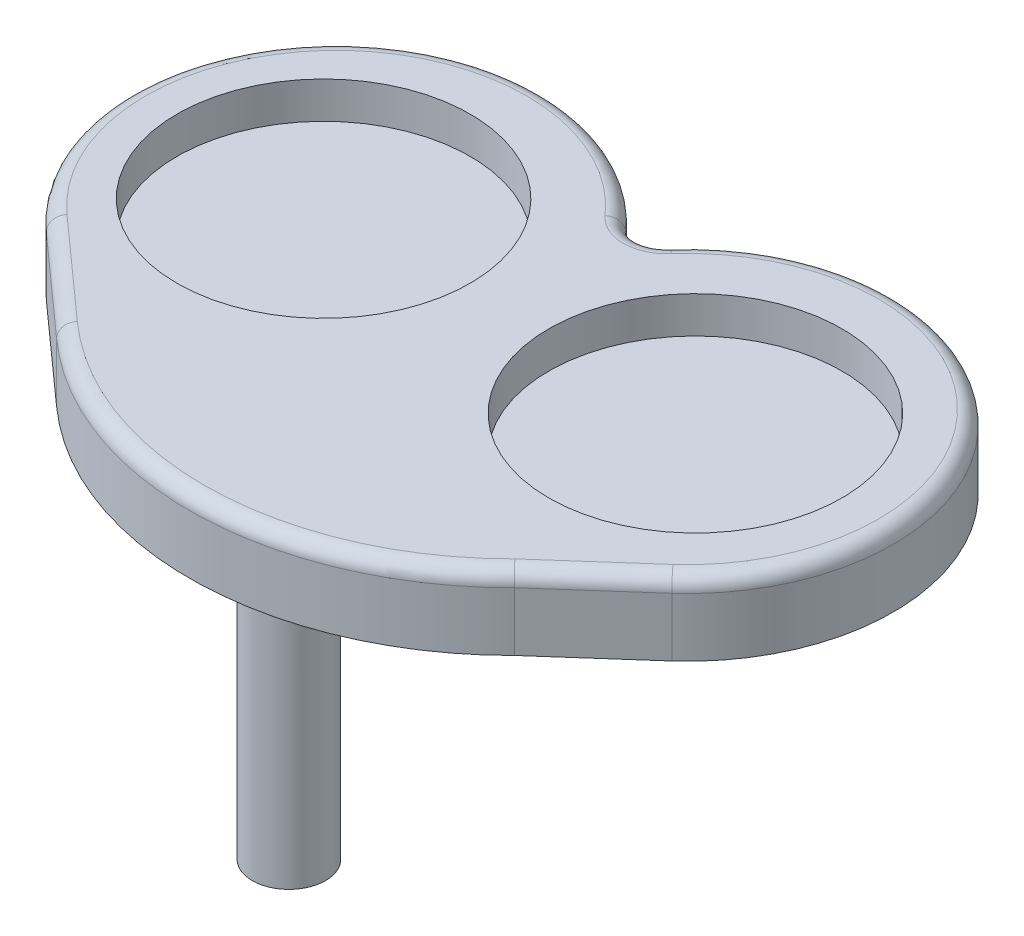
ISO-10303-21;
HEADER;
FILE_DESCRIPTION(('STEP AP214'),'2;1');
FILE_NAME('part.step','',(''),(''),'','','');
FILE_SCHEMA(('AUTOMOTIVE_DESIGN { 1 0 10303 214 1 1 1 1 }'));
ENDSEC;
DATA;
#1=APPLICATION_CONTEXT('core data for automotive mechanical design processes');
#2=APPLICATION_PROTOCOL_DEFINITION('international standard','automotive_design',2000,#1);
#3=PRODUCT_CONTEXT('',#1,'mechanical');
#4=PRODUCT('Part','Part','',(#3));
#5=PRODUCT_RELATED_PRODUCT_CATEGORY('part','',(#4));
#6=PRODUCT_DEFINITION_FORMATION('','',#4);
#7=PRODUCT_DEFINITION_CONTEXT('part definition',#1,'design');
#8=PRODUCT_DEFINITION('design','',#6,#7);
#9=PRODUCT_DEFINITION_SHAPE('','',#8);
#10=(LENGTH_UNIT() NAMED_UNIT(*) SI_UNIT(.MILLI.,.METRE.));
#11=(NAMED_UNIT(*) PLANE_ANGLE_UNIT() SI_UNIT($,.RADIAN.));
#12=(NAMED_UNIT(*) SI_UNIT($,.STERADIAN.) SOLID_ANGLE_UNIT());
#13=UNCERTAINTY_MEASURE_WITH_UNIT(LENGTH_MEASURE(1.E-05),#10,'distance_accuracy_value','');
#14=(GEOMETRIC_REPRESENTATION_CONTEXT(3) GLOBAL_UNCERTAINTY_ASSIGNED_CONTEXT((#13)) GLOBAL_UNIT_ASSIGNED_CONTEXT((#10,
#11,#12)) REPRESENTATION_CONTEXT('',''));
#15=CARTESIAN_POINT('',(0.,0.,0.));
#16=DIRECTION('',(0.,0.,1.));
#17=DIRECTION('',(1.,0.,0.));
#18=AXIS2_PLACEMENT_3D('',#15,#16,#17);
#19=CARTESIAN_POINT('',(9.81783085724041,6.35,0.));
#20=DIRECTION('',(0.,-1.,0.));
#21=DIRECTION('',(0.,0.,-1.));
#22=AXIS2_PLACEMENT_3D('',#19,#20,#21);
#23=CYLINDRICAL_SURFACE('',#22,17.78);
#24=DIRECTION('',(0.,-1.,0.));
#25=VECTOR('',#24,1.);
#26=CARTESIAN_POINT('',(-3.51716914275959,6.35,-11.7603645776821));
#27=LINE('',#26,#25);
#28=CARTESIAN_POINT('',(-3.51716914275959,0.,-11.7603645776821));
#29=VERTEX_POINT('',#28);
#30=CARTESIAN_POINT('',(-3.51716914275959,5.08,-11.7603645776821));
#31=VERTEX_POINT('',#30);
#32=EDGE_CURVE('E157',#29,#31,#27,.F.);
#33=ORIENTED_EDGE('',*,*,#32,.T.);
#34=CARTESIAN_POINT('',(9.81783085724041,5.08,0.));
#35=DIRECTION('',(0.,1.,0.));
#36=DIRECTION('',(0.,0.,1.));
#37=AXIS2_PLACEMENT_3D('',#34,#35,#36);
#38=CIRCLE('',#37,17.78);
#39=CARTESIAN_POINT('',(21.6711641905737,5.08,13.2524295466488));
#40=VERTEX_POINT('',#39);
#41=EDGE_CURVE('E187',#31,#40,#38,.F.);
#42=ORIENTED_EDGE('',*,*,#41,.T.);
#43=DIRECTION('',(0.,-1.,0.));
#44=VECTOR('',#43,1.);
#45=CARTESIAN_POINT('',(21.6711641905737,6.35,13.2524295466488));
#46=LINE('',#45,#44);
#47=CARTESIAN_POINT('',(21.6711641905737,0.,13.2524295466488));
#48=VERTEX_POINT('',#47);
#49=EDGE_CURVE('E147',#40,#48,#46,.T.);
#50=ORIENTED_EDGE('',*,*,#49,.T.);
#51=CARTESIAN_POINT('',(9.81783085724041,0.,0.));
#52=DIRECTION('',(0.,1.,0.));
#53=DIRECTION('',(0.,0.,1.));
#54=AXIS2_PLACEMENT_3D('',#51,#52,#53);
#55=CIRCLE('',#54,17.78);
#56=EDGE_CURVE('E131',#48,#29,#55,.T.);
#57=ORIENTED_EDGE('',*,*,#56,.T.);
#58=EDGE_LOOP('',(#33,#42,#50,#57));
#59=FACE_BOUND('',#58,.T.);
#60=ADVANCED_FACE('F41',(#59),#23,.T.);
#61=CARTESIAN_POINT('',(-20.6621691427596,6.35,0.));
#62=DIRECTION('',(0.,-1.,0.));
#63=DIRECTION('',(0.,0.,-1.));
#64=AXIS2_PLACEMENT_3D('',#61,#62,#63);
#65=CYLINDRICAL_SURFACE('',#64,17.78);
#66=DIRECTION('',(0.,-1.,0.));
#67=VECTOR('',#66,1.);
#68=CARTESIAN_POINT('',(-32.5155024760929,6.35,13.2524295466487));
#69=LINE('',#68,#67);
#70=CARTESIAN_POINT('',(-32.5155024760929,5.08,13.2524295466487));
#71=VERTEX_POINT('',#70);
#72=CARTESIAN_POINT('',(-32.5155024760929,0.,13.2524295466487));
#73=VERTEX_POINT('',#72);
#74=EDGE_CURVE('E112',#71,#73,#69,.T.);
#75=ORIENTED_EDGE('',*,*,#74,.F.);
#76=CARTESIAN_POINT('',(-20.6621691427596,5.08,0.));
#77=DIRECTION('',(0.,1.,0.));
#78=DIRECTION('',(0.,0.,1.));
#79=AXIS2_PLACEMENT_3D('',#76,#77,#78);
#80=CIRCLE('',#79,17.78);
#81=CARTESIAN_POINT('',(-7.32716914275959,5.08,-11.7603645776821));
#82=VERTEX_POINT('',#81);
#83=EDGE_CURVE('E193',#71,#82,#80,.F.);
#84=ORIENTED_EDGE('',*,*,#83,.T.);
#85=DIRECTION('',(0.,-1.,0.));
#86=VECTOR('',#85,1.);
#87=CARTESIAN_POINT('',(-7.32716914275959,6.35,-11.7603645776821));
#88=LINE('',#87,#86);
#89=CARTESIAN_POINT('',(-7.32716914275959,0.,-11.7603645776821));
#90=VERTEX_POINT('',#89);
#91=EDGE_CURVE('E121',#82,#90,#88,.T.);
#92=ORIENTED_EDGE('',*,*,#91,.T.);
#93=CARTESIAN_POINT('',(-20.6621691427596,0.,0.));
#94=DIRECTION('',(0.,1.,0.));
#95=DIRECTION('',(0.,0.,1.));
#96=AXIS2_PLACEMENT_3D('',#93,#94,#95);
#97=CIRCLE('',#96,17.78);
#98=EDGE_CURVE('E125',#90,#73,#97,.T.);
#99=ORIENTED_EDGE('',*,*,#98,.T.);
#100=EDGE_LOOP('',(#75,#84,#92,#99));
#101=FACE_BOUND('',#100,.T.);
#102=ADVANCED_FACE('F126',(#101),#65,.T.);
#103=CARTESIAN_POINT('',(-32.5155024760929,6.35,13.2524295466488));
#104=DIRECTION('',(0.666666666666666,0.,-0.74535599249993));
#105=DIRECTION('',(-0.74535599249993,0.,-0.666666666666666));
#106=AXIS2_PLACEMENT_3D('',#103,#104,#105);
#107=PLANE('',#106);
#108=DIRECTION('',(0.,-1.,0.));
#109=VECTOR('',#108,1.);
#110=CARTESIAN_POINT('',(-24.0488358094262,6.35,20.825246430448));
#111=LINE('',#110,#109);
#112=CARTESIAN_POINT('',(-24.0488358094262,5.08,20.825246430448));
#113=VERTEX_POINT('',#112);
#114=CARTESIAN_POINT('',(-24.0488358094262,0.,20.825246430448));
#115=VERTEX_POINT('',#114);
#116=EDGE_CURVE('E122',#113,#115,#111,.T.);
#117=ORIENTED_EDGE('',*,*,#116,.F.);
#118=DIRECTION('',(0.74535599249993,0.,0.666666666666666));
#119=VECTOR('',#118,1.);
#120=CARTESIAN_POINT('',(-32.5155024760929,5.08,13.2524295466487));
#121=LINE('',#120,#119);
#122=EDGE_CURVE('E64',#113,#71,#121,.F.);
#123=ORIENTED_EDGE('',*,*,#122,.T.);
#124=ORIENTED_EDGE('',*,*,#74,.T.);
#125=DIRECTION('',(0.74535599249993,0.,0.666666666666666));
#126=VECTOR('',#125,1.);
#127=CARTESIAN_POINT('',(-32.5155024760929,0.,13.2524295466488));
#128=LINE('',#127,#126);
#129=EDGE_CURVE('E116',#73,#115,#128,.T.);
#130=ORIENTED_EDGE('',*,*,#129,.T.);
#131=EDGE_LOOP('',(#117,#123,#124,#130));
#132=FACE_BOUND('',#131,.T.);
#133=ADVANCED_FACE('F114',(#132),#107,.F.);
#134=CARTESIAN_POINT('',(-5.42216914275959,6.35,0.));
#135=DIRECTION('',(0.,-1.,0.));
#136=DIRECTION('',(0.,0.,-1.));
#137=AXIS2_PLACEMENT_3D('',#134,#135,#136);
#138=CYLINDRICAL_SURFACE('',#137,27.94);
#139=DIRECTION('',(0.,-1.,0.));
#140=VECTOR('',#139,1.);
#141=CARTESIAN_POINT('',(14.4307123167573,6.35,19.6597735936702));
#142=LINE('',#141,#140);
#143=CARTESIAN_POINT('',(14.4307123167573,5.08,19.6597735936702));
#144=VERTEX_POINT('',#143);
#145=CARTESIAN_POINT('',(14.4307123167573,0.,19.6597735936702));
#146=VERTEX_POINT('',#145);
#147=EDGE_CURVE('E150',#144,#146,#142,.T.);
#148=ORIENTED_EDGE('',*,*,#147,.F.);
#149=CARTESIAN_POINT('',(-5.42216914275959,5.08,0.));
#150=DIRECTION('',(0.,1.,0.));
#151=DIRECTION('',(0.,0.,1.));
#152=AXIS2_PLACEMENT_3D('',#149,#150,#151);
#153=CIRCLE('',#152,27.94);
#154=EDGE_CURVE('E57',#144,#113,#153,.F.);
#155=ORIENTED_EDGE('',*,*,#154,.T.);
#156=ORIENTED_EDGE('',*,*,#116,.T.);
#157=CARTESIAN_POINT('',(-5.42216914275959,0.,0.));
#158=DIRECTION('',(0.,1.,0.));
#159=DIRECTION('',(0.,0.,1.));
#160=AXIS2_PLACEMENT_3D('',#157,#158,#159);
#161=CIRCLE('',#160,27.94);
#162=EDGE_CURVE('E137',#115,#146,#161,.T.);
#163=ORIENTED_EDGE('',*,*,#162,.T.);
#164=EDGE_LOOP('',(#148,#155,#156,#163));
#165=FACE_BOUND('',#164,.T.);
#166=ADVANCED_FACE('F342',(#165),#138,.T.);
#167=CARTESIAN_POINT('',(21.6711641905737,6.35,13.2524295466488));
#168=DIRECTION('',(0.662709004138353,0.,0.748877009818002));
#169=DIRECTION('',(0.748877009818002,0.,-0.662709004138353));
#170=AXIS2_PLACEMENT_3D('',#167,#168,#169);
#171=PLANE('',#170);
#172=ORIENTED_EDGE('',*,*,#49,.F.);
#173=DIRECTION('',(-0.748877009818002,0.,0.662709004138353));
#174=VECTOR('',#173,1.);
#175=CARTESIAN_POINT('',(21.6711641905737,5.08,13.2524295466488));
#176=LINE('',#175,#174);
#177=EDGE_CURVE('E164',#40,#144,#176,.T.);
#178=ORIENTED_EDGE('',*,*,#177,.T.);
#179=ORIENTED_EDGE('',*,*,#147,.T.);
#180=DIRECTION('',(-0.748877009818002,0.,0.662709004138353));
#181=VECTOR('',#180,1.);
#182=CARTESIAN_POINT('',(21.6711641905737,0.,13.2524295466488));
#183=LINE('',#182,#181);
#184=EDGE_CURVE('E141',#48,#146,#183,.T.);
#185=ORIENTED_EDGE('',*,*,#184,.F.);
#186=EDGE_LOOP('',(#172,#178,#179,#185));
#187=FACE_BOUND('',#186,.T.);
#188=ADVANCED_FACE('F295',(#187),#171,.T.);
#189=CARTESIAN_POINT('',(9.81783085724041,6.35,0.));
#190=DIRECTION('',(0.,1.,0.));
#191=DIRECTION('',(0.,0.,1.));
#192=AXIS2_PLACEMENT_3D('',#189,#190,#191);
#193=PLANE('',#192);
#194=CARTESIAN_POINT('',(-5.42216914275959,6.35,0.));
#195=DIRECTION('',(0.,1.,0.));
#196=DIRECTION('',(0.,0.,1.));
#197=AXIS2_PLACEMENT_3D('',#194,#195,#196);
#198=CIRCLE('',#197,26.67);
#199=CARTESIAN_POINT('',(-23.2021691427596,6.35,19.8786443199731));
#200=VERTEX_POINT('',#199);
#201=CARTESIAN_POINT('',(13.5573793711291,6.35,18.7367456675097));
#202=VERTEX_POINT('',#201);
#203=EDGE_CURVE('E168',#200,#202,#198,.T.);
#204=ORIENTED_EDGE('',*,*,#203,.T.);
#205=DIRECTION('',(-0.748877009818002,0.,0.662709004138353));
#206=VECTOR('',#205,1.);
#207=CARTESIAN_POINT('',(20.7589911966876,6.35,12.363772617814));
#208=LINE('',#207,#206);
#209=CARTESIAN_POINT('',(20.8269580525018,6.35,12.3036262296348));
#210=VERTEX_POINT('',#209);
#211=EDGE_CURVE('E183',#202,#210,#208,.F.);
#212=ORIENTED_EDGE('',*,*,#211,.T.);
#213=CARTESIAN_POINT('',(9.81783085724041,6.35,0.));
#214=DIRECTION('',(0.,1.,0.));
#215=DIRECTION('',(0.,0.,1.));
#216=AXIS2_PLACEMENT_3D('',#213,#214,#215);
#217=CIRCLE('',#216,16.51);
#218=CARTESIAN_POINT('',(-2.56466914275959,6.35,-10.9203385364191));
#219=VERTEX_POINT('',#218);
#220=EDGE_CURVE('E180',#210,#219,#217,.T.);
#221=ORIENTED_EDGE('',*,*,#220,.T.);
#222=CARTESIAN_POINT('',(-5.42216914275959,6.35,-13.4404166602081));
#223=DIRECTION('',(0.,1.,0.));
#224=DIRECTION('',(0.,0.,1.));
#225=AXIS2_PLACEMENT_3D('',#222,#223,#224);
#226=CIRCLE('',#225,3.81);
#227=CARTESIAN_POINT('',(-8.27966914275959,6.35,-10.9203385364191));
#228=VERTEX_POINT('',#227);
#229=EDGE_CURVE('E177',#219,#228,#226,.F.);
#230=ORIENTED_EDGE('',*,*,#229,.T.);
#231=CARTESIAN_POINT('',(-20.6621691427596,6.35,0.));
#232=DIRECTION('',(0.,1.,0.));
#233=DIRECTION('',(0.,0.,1.));
#234=AXIS2_PLACEMENT_3D('',#231,#232,#233);
#235=CIRCLE('',#234,16.51);
#236=CARTESIAN_POINT('',(-31.6688358094263,6.35,12.3058274361738));
#237=VERTEX_POINT('',#236);
#238=EDGE_CURVE('E174',#228,#237,#235,.T.);
#239=ORIENTED_EDGE('',*,*,#238,.T.);
#240=DIRECTION('',(0.74535599249993,0.,0.666666666666666));
#241=VECTOR('',#240,1.);
#242=CARTESIAN_POINT('',(-23.2021691427596,6.35,19.8786443199731));
#243=LINE('',#242,#241);
#244=EDGE_CURVE('E171',#237,#200,#243,.T.);
#245=ORIENTED_EDGE('',*,*,#244,.T.);
#246=EDGE_LOOP('',(#204,#212,#221,#230,#239,#245));
#247=FACE_BOUND('',#246,.T.);
#248=CARTESIAN_POINT('',(-21.7480419925664,6.35,0.));
#249=DIRECTION('',(0.,1.,0.));
#250=DIRECTION('',(0.,0.,1.));
#251=AXIS2_PLACEMENT_3D('',#248,#249,#250);
#252=CIRCLE('',#251,12.7);
#253=CARTESIAN_POINT('',(-21.7480419925664,6.35,12.7));
#254=VERTEX_POINT('',#253);
#255=EDGE_CURVE('E300',#254,#254,#252,.T.);
#256=ORIENTED_EDGE('',*,*,#255,.F.);
#257=EDGE_LOOP('',(#256));
#258=FACE_BOUND('',#257,.T.);
#259=CARTESIAN_POINT('',(10.4631265009587,6.35,0.));
#260=DIRECTION('',(0.,1.,0.));
#261=DIRECTION('',(0.,0.,1.));
#262=AXIS2_PLACEMENT_3D('',#259,#260,#261);
#263=CIRCLE('',#262,12.7);
#264=CARTESIAN_POINT('',(10.4631265009587,6.35,12.7));
#265=VERTEX_POINT('',#264);
#266=EDGE_CURVE('E278',#265,#265,#263,.T.);
#267=ORIENTED_EDGE('',*,*,#266,.F.);
#268=EDGE_LOOP('',(#267));
#269=FACE_BOUND('',#268,.T.);
#270=ADVANCED_FACE('F266',(#247,#258,#269),#193,.T.);
#271=CARTESIAN_POINT('',(9.81783085724041,0.,0.));
#272=DIRECTION('',(0.,1.,0.));
#273=DIRECTION('',(0.,0.,1.));
#274=AXIS2_PLACEMENT_3D('',#271,#272,#273);
#275=PLANE('',#274);
#276=CARTESIAN_POINT('',(-5.42216914275966,0.,19.3277116350634));
#277=DIRECTION('',(0.,1.,0.));
#278=DIRECTION('',(0.,0.,1.));
#279=AXIS2_PLACEMENT_3D('',#276,#277,#278);
#280=CIRCLE('',#279,5.715);
#281=CARTESIAN_POINT('',(-5.42216914275966,0.,25.0427116350634));
#282=VERTEX_POINT('',#281);
#283=EDGE_CURVE('E11',#282,#282,#280,.T.);
#284=ORIENTED_EDGE('',*,*,#283,.T.);
#285=EDGE_LOOP('',(#284));
#286=FACE_BOUND('',#285,.T.);
#287=ORIENTED_EDGE('',*,*,#56,.F.);
#288=ORIENTED_EDGE('',*,*,#184,.T.);
#289=ORIENTED_EDGE('',*,*,#162,.F.);
#290=ORIENTED_EDGE('',*,*,#129,.F.);
#291=ORIENTED_EDGE('',*,*,#98,.F.);
#292=CARTESIAN_POINT('',(-5.42216914275959,0.,-13.4404166602081));
#293=DIRECTION('',(0.,1.,0.));
#294=DIRECTION('',(0.,0.,1.));
#295=AXIS2_PLACEMENT_3D('',#292,#293,#294);
#296=CIRCLE('',#295,2.54);
#297=EDGE_CURVE('E161',#90,#29,#296,.T.);
#298=ORIENTED_EDGE('',*,*,#297,.T.);
#299=EDGE_LOOP('',(#287,#288,#289,#290,#291,#298));
#300=FACE_BOUND('',#299,.T.);
#301=ADVANCED_FACE('F134',(#286,#300),#275,.F.);
#302=CARTESIAN_POINT('',(-5.42216914275959,6.35,-13.4404166602081));
#303=DIRECTION('',(0.,1.,0.));
#304=DIRECTION('',(0.,0.,1.));
#305=AXIS2_PLACEMENT_3D('',#302,#303,#304);
#306=CYLINDRICAL_SURFACE('',#305,2.54);
#307=ORIENTED_EDGE('',*,*,#91,.F.);
#308=CARTESIAN_POINT('',(-5.42216914275959,5.08,-13.4404166602081));
#309=DIRECTION('',(0.,1.,0.));
#310=DIRECTION('',(0.,0.,1.));
#311=AXIS2_PLACEMENT_3D('',#308,#309,#310);
#312=CIRCLE('',#311,2.54);
#313=EDGE_CURVE('E190',#82,#31,#312,.T.);
#314=ORIENTED_EDGE('',*,*,#313,.T.);
#315=ORIENTED_EDGE('',*,*,#32,.F.);
#316=ORIENTED_EDGE('',*,*,#297,.F.);
#317=EDGE_LOOP('',(#307,#314,#315,#316));
#318=FACE_BOUND('',#317,.T.);
#319=ADVANCED_FACE('F255',(#318),#306,.F.);
#320=CARTESIAN_POINT('',(10.4631265009587,3.175,0.));
#321=DIRECTION('',(0.,1.,0.));
#322=DIRECTION('',(0.,0.,1.));
#323=AXIS2_PLACEMENT_3D('',#320,#321,#322);
#324=CYLINDRICAL_SURFACE('',#323,12.7);
#325=CARTESIAN_POINT('',(10.4631265009587,3.175,0.));
#326=DIRECTION('',(0.,1.,0.));
#327=DIRECTION('',(0.,0.,1.));
#328=AXIS2_PLACEMENT_3D('',#325,#326,#327);
#329=CIRCLE('',#328,12.7);
#330=CARTESIAN_POINT('',(10.4631265009587,3.175,12.7));
#331=VERTEX_POINT('',#330);
#332=EDGE_CURVE('E306',#331,#331,#329,.T.);
#333=ORIENTED_EDGE('',*,*,#332,.F.);
#334=EDGE_LOOP('',(#333));
#335=FACE_BOUND('',#334,.T.);
#336=ORIENTED_EDGE('',*,*,#266,.T.);
#337=EDGE_LOOP('',(#336));
#338=FACE_BOUND('',#337,.T.);
#339=ADVANCED_FACE('F257',(#335,#338),#324,.F.);
#340=CARTESIAN_POINT('',(10.4631265009587,3.175,0.));
#341=DIRECTION('',(0.,1.,0.));
#342=DIRECTION('',(0.,0.,1.));
#343=AXIS2_PLACEMENT_3D('',#340,#341,#342);
#344=PLANE('',#343);
#345=ORIENTED_EDGE('',*,*,#332,.T.);
#346=EDGE_LOOP('',(#345));
#347=FACE_BOUND('',#346,.T.);
#348=ADVANCED_FACE('F263',(#347),#344,.T.);
#349=CARTESIAN_POINT('',(-21.7480419925664,3.175,0.));
#350=DIRECTION('',(0.,1.,0.));
#351=DIRECTION('',(0.,0.,1.));
#352=AXIS2_PLACEMENT_3D('',#349,#350,#351);
#353=CYLINDRICAL_SURFACE('',#352,12.7);
#354=CARTESIAN_POINT('',(-21.7480419925664,3.175,0.));
#355=DIRECTION('',(0.,1.,0.));
#356=DIRECTION('',(0.,0.,1.));
#357=AXIS2_PLACEMENT_3D('',#354,#355,#356);
#358=CIRCLE('',#357,12.7);
#359=CARTESIAN_POINT('',(-21.7480419925664,3.175,12.7));
#360=VERTEX_POINT('',#359);
#361=EDGE_CURVE('E297',#360,#360,#358,.T.);
#362=ORIENTED_EDGE('',*,*,#361,.F.);
#363=EDGE_LOOP('',(#362));
#364=FACE_BOUND('',#363,.T.);
#365=ORIENTED_EDGE('',*,*,#255,.T.);
#366=EDGE_LOOP('',(#365));
#367=FACE_BOUND('',#366,.T.);
#368=ADVANCED_FACE('F243',(#364,#367),#353,.F.);
#369=CARTESIAN_POINT('',(-21.7480419925664,3.175,0.));
#370=DIRECTION('',(0.,1.,0.));
#371=DIRECTION('',(0.,0.,1.));
#372=AXIS2_PLACEMENT_3D('',#369,#370,#371);
#373=PLANE('',#372);
#374=ORIENTED_EDGE('',*,*,#361,.T.);
#375=EDGE_LOOP('',(#374));
#376=FACE_BOUND('',#375,.T.);
#377=ADVANCED_FACE('F238',(#376),#373,.T.);
#378=CARTESIAN_POINT('',(-20.6621691427596,5.08,0.));
#379=DIRECTION('',(0.,1.,0.));
#380=DIRECTION('',(0.,0.,1.));
#381=AXIS2_PLACEMENT_3D('',#378,#379,#380);
#382=TOROIDAL_SURFACE('',#381,16.51,1.27);
#383=CARTESIAN_POINT('',(-31.6688358094263,5.08,12.3058274361738));
#384=DIRECTION('',(0.745355992499928,0.,0.666666666666669));
#385=DIRECTION('',(0.666666666666669,0.,-0.745355992499928));
#386=AXIS2_PLACEMENT_3D('',#383,#384,#385);
#387=CIRCLE('',#386,1.27);
#388=EDGE_CURVE('E279',#237,#71,#387,.T.);
#389=ORIENTED_EDGE('',*,*,#388,.F.);
#390=ORIENTED_EDGE('',*,*,#238,.F.);
#391=CARTESIAN_POINT('',(-8.27966914275959,5.08,-10.9203385364191));
#392=DIRECTION('',(0.661437827766148,0.,0.75));
#393=DIRECTION('',(0.75,0.,-0.661437827766148));
#394=AXIS2_PLACEMENT_3D('',#391,#392,#393);
#395=CIRCLE('',#394,1.27);
#396=EDGE_CURVE('E274',#82,#228,#395,.T.);
#397=ORIENTED_EDGE('',*,*,#396,.F.);
#398=ORIENTED_EDGE('',*,*,#83,.F.);
#399=EDGE_LOOP('',(#389,#390,#397,#398));
#400=FACE_BOUND('',#399,.T.);
#401=ADVANCED_FACE('F235',(#400),#382,.T.);
#402=CARTESIAN_POINT('',(-5.42216914275959,5.08,-13.4404166602081));
#403=DIRECTION('',(0.,1.,0.));
#404=DIRECTION('',(0.,0.,1.));
#405=AXIS2_PLACEMENT_3D('',#402,#403,#404);
#406=TOROIDAL_SURFACE('',#405,3.81,1.27);
#407=ORIENTED_EDGE('',*,*,#396,.T.);
#408=ORIENTED_EDGE('',*,*,#229,.F.);
#409=CARTESIAN_POINT('',(-2.56466914275959,5.08,-10.9203385364191));
#410=DIRECTION('',(0.661437827766148,0.,-0.75));
#411=DIRECTION('',(-0.75,0.,-0.661437827766148));
#412=AXIS2_PLACEMENT_3D('',#409,#410,#411);
#413=CIRCLE('',#412,1.27);
#414=EDGE_CURVE('E283',#31,#219,#413,.T.);
#415=ORIENTED_EDGE('',*,*,#414,.F.);
#416=ORIENTED_EDGE('',*,*,#313,.F.);
#417=EDGE_LOOP('',(#407,#408,#415,#416));
#418=FACE_BOUND('',#417,.T.);
#419=ADVANCED_FACE('F232',(#418),#406,.T.);
#420=CARTESIAN_POINT('',(-14.7355024760929,5.08,27.4514612037724));
#421=DIRECTION('',(-0.74535599249993,0.,-0.666666666666666));
#422=DIRECTION('',(-0.666666666666666,0.,0.74535599249993));
#423=AXIS2_PLACEMENT_3D('',#420,#421,#422);
#424=CYLINDRICAL_SURFACE('',#423,1.27);
#425=ORIENTED_EDGE('',*,*,#388,.T.);
#426=ORIENTED_EDGE('',*,*,#122,.F.);
#427=CARTESIAN_POINT('',(-23.2021691427596,5.08,19.8786443199731));
#428=DIRECTION('',(0.745355992499932,0.,0.666666666666665));
#429=DIRECTION('',(0.666666666666665,0.,-0.745355992499932));
#430=AXIS2_PLACEMENT_3D('',#427,#428,#429);
#431=CIRCLE('',#430,1.27);
#432=EDGE_CURVE('E287',#200,#113,#431,.T.);
#433=ORIENTED_EDGE('',*,*,#432,.F.);
#434=ORIENTED_EDGE('',*,*,#244,.F.);
#435=EDGE_LOOP('',(#425,#426,#433,#434));
#436=FACE_BOUND('',#435,.T.);
#437=ADVANCED_FACE('F228',(#436),#424,.T.);
#438=CARTESIAN_POINT('',(9.81783085724041,5.08,0.));
#439=DIRECTION('',(0.,1.,0.));
#440=DIRECTION('',(0.,0.,1.));
#441=AXIS2_PLACEMENT_3D('',#438,#439,#440);
#442=TOROIDAL_SURFACE('',#441,16.51,1.27);
#443=ORIENTED_EDGE('',*,*,#414,.T.);
#444=ORIENTED_EDGE('',*,*,#220,.F.);
#445=CARTESIAN_POINT('',(21.6711641905737,5.08,13.2524295466488));
#446=CARTESIAN_POINT('',(21.671164031047,5.11572951696822,13.2524293685785));
#447=CARTESIAN_POINT('',(21.6701613425862,5.15144191539153,13.2513023342482));
#448=CARTESIAN_POINT('',(21.6661612042966,5.222611186689,13.2468061369938));
#449=CARTESIAN_POINT('',(21.6631638498341,5.25806807169751,13.2434370812624));
#450=CARTESIAN_POINT('',(21.6512075679367,5.36361850382279,13.2299981233284));
#451=CARTESIAN_POINT('',(21.6392843476616,5.43300497684825,13.2165963467758));
#452=CARTESIAN_POINT('',(21.6078640472878,5.56777977696345,13.1812799616697));
#453=CARTESIAN_POINT('',(21.5883632842149,5.63316614193393,13.1593612135436));
#454=CARTESIAN_POINT('',(21.5423455630263,5.75807709182108,13.1076380281985));
#455=CARTESIAN_POINT('',(21.5158305268822,5.81760327635644,13.0778357511348));
#456=CARTESIAN_POINT('',(21.4565386334783,5.92910620860506,13.011193820539));
#457=CARTESIAN_POINT('',(21.4237624539079,5.98108377228995,12.9743549286312));
#458=CARTESIAN_POINT('',(21.352855814484,6.07604977159711,12.8946602597369));
#459=CARTESIAN_POINT('',(21.3147227214387,6.11903376040183,12.8518015236966));
#460=CARTESIAN_POINT('',(21.2341851957734,6.19477713974643,12.7612847639685));
#461=CARTESIAN_POINT('',(21.1917784571047,6.22753097062174,12.7136241492022));
#462=CARTESIAN_POINT('',(21.1039489443971,6.28181594874998,12.6149148632709));
#463=CARTESIAN_POINT('',(21.0585310116777,6.30336464058596,12.5638716306481));
#464=CARTESIAN_POINT('',(20.9922909649877,6.3257922285325,12.4894286345952));
#465=CARTESIAN_POINT('',(20.9721401128021,6.33146102513571,12.4667825341004));
#466=CARTESIAN_POINT('',(20.9316322637527,6.34057607675162,12.4212590071911));
#467=CARTESIAN_POINT('',(20.9112754846913,6.34402447221065,12.3983818252156));
#468=CARTESIAN_POINT('',(20.8696010773939,6.34878549631207,12.3515480066813));
#469=CARTESIAN_POINT('',(20.848278648414,6.35000350169456,12.327585989887));
#470=CARTESIAN_POINT('',(20.826958052502,6.35,12.3036262296346));
#471=B_SPLINE_CURVE_WITH_KNOTS('',3,(#445,#446,#447,#448,#449,#450,#451,#452,#453,#454,#455,
#456,#457,#458,#459,#460,#461,#462,#463,#464,#465,#466,#467,#468,#469,#470),.UNSPECIFIED.,.F.,
.F.,(4,2,2,2,2,2,2,2,2,2,2,2,4),(0.,0.107122712775484,0.214240304307982,0.42814036133784,
0.642144512244543,0.856090084790349,1.07001251355095,1.28404046627549,1.49818453269773,
1.71199228307574,1.80444621163831,1.89681088149982,1.99301058953558),.UNSPECIFIED.);
#472=EDGE_CURVE('E209',#40,#210,#471,.T.);
#473=ORIENTED_EDGE('',*,*,#472,.F.);
#474=ORIENTED_EDGE('',*,*,#41,.F.);
#475=EDGE_LOOP('',(#443,#444,#473,#474));
#476=FACE_BOUND('',#475,.T.);
#477=ADVANCED_FACE('F223',(#476),#442,.T.);
#478=CARTESIAN_POINT('',(-5.42216914275959,5.08,0.));
#479=DIRECTION('',(0.,1.,0.));
#480=DIRECTION('',(0.,0.,1.));
#481=AXIS2_PLACEMENT_3D('',#478,#479,#480);
#482=TOROIDAL_SURFACE('',#481,26.67,1.27);
#483=ORIENTED_EDGE('',*,*,#432,.T.);
#484=ORIENTED_EDGE('',*,*,#154,.F.);
#485=CARTESIAN_POINT('',(14.4307123167573,5.08,19.6597735936702));
#486=CARTESIAN_POINT('',(14.4307121550175,5.11571572009997,19.659773432083));
#487=CARTESIAN_POINT('',(14.4296760452213,5.15141432379599,19.6586775137315));
#488=CARTESIAN_POINT('',(14.4255425959639,5.22255599360446,19.654305526228));
#489=CARTESIAN_POINT('',(14.4224453572895,5.25799907212613,19.6510295636776));
#490=CARTESIAN_POINT('',(14.4100909455388,5.36350602721714,19.6379624015918));
#491=CARTESIAN_POINT('',(14.3977709980559,5.43286296125348,19.6249318439175));
#492=CARTESIAN_POINT('',(14.3653060480763,5.56757921058985,19.5905961238378));
#493=CARTESIAN_POINT('',(14.3451573476854,5.63293661981126,19.5692870510945));
#494=CARTESIAN_POINT('',(14.2976105346305,5.75779592792078,19.5190056100555));
#495=CARTESIAN_POINT('',(14.2702141371013,5.81729920759781,19.4900350548157));
#496=CARTESIAN_POINT('',(14.2089425105404,5.92877956046987,19.4252486362505));
#497=CARTESIAN_POINT('',(14.1750661141858,5.98075527466214,19.3894315395732));
#498=CARTESIAN_POINT('',(14.1017829652569,6.07571677428637,19.3119582866126));
#499=CARTESIAN_POINT('',(14.0623742542739,6.11869936272461,19.2703000626088));
#500=CARTESIAN_POINT('',(13.9791262095195,6.19446423971237,19.1823104255733));
#501=CARTESIAN_POINT('',(13.9352832599177,6.22723811342875,19.135975198815));
#502=CARTESIAN_POINT('',(13.8444530331573,6.28158769786825,19.0399939354752));
#503=CARTESIAN_POINT('',(13.7974688250467,6.30317416341482,18.9903511305967));
#504=CARTESIAN_POINT('',(13.7211456021777,6.32821128252079,18.9097199222798));
#505=CARTESIAN_POINT('',(13.6923700530782,6.33546632088186,18.8793225100616));
#506=CARTESIAN_POINT('',(13.6344890298958,6.34575131830116,18.8181840550556));
#507=CARTESIAN_POINT('',(13.6053840943505,6.34878738486804,18.7874435740728));
#508=CARTESIAN_POINT('',(13.5699679720323,6.34990132813458,18.7500402633835));
#509=CARTESIAN_POINT('',(13.5636732255636,6.35000026502288,18.74339243616));
#510=CARTESIAN_POINT('',(13.5573793711291,6.35,18.7367456675098));
#511=B_SPLINE_CURVE_WITH_KNOTS('',3,(#485,#486,#487,#488,#489,#490,#491,#492,#493,#494,#495,
#496,#497,#498,#499,#500,#501,#502,#503,#504,#505,#506,#507,#508,#509,#510),.UNSPECIFIED.,.F.,
.F.,(4,2,2,2,2,2,2,2,2,2,2,2,4),(0.,0.107081331324099,0.214157426878719,0.427968009238932,
0.641879707575719,0.855740829886786,1.06964051400453,1.28361610925893,1.49776761628537,
1.7117128687553,1.83897693094363,1.96605656929957,1.99352126117454),.UNSPECIFIED.);
#512=EDGE_CURVE('E200',#202,#144,#511,.F.);
#513=ORIENTED_EDGE('',*,*,#512,.F.);
#514=ORIENTED_EDGE('',*,*,#203,.F.);
#515=EDGE_LOOP('',(#483,#484,#513,#514));
#516=FACE_BOUND('',#515,.T.);
#517=ADVANCED_FACE('F220',(#516),#482,.T.);
#518=CARTESIAN_POINT('',(20.829523755318,5.08,12.3013557441799));
#519=DIRECTION('',(-0.748877009818002,0.,0.662709004138353));
#520=DIRECTION('',(0.662709004138353,0.,0.748877009818002));
#521=AXIS2_PLACEMENT_3D('',#518,#519,#520);
#522=CYLINDRICAL_SURFACE('',#521,1.27);
#523=ORIENTED_EDGE('',*,*,#472,.T.);
#524=ORIENTED_EDGE('',*,*,#211,.F.);
#525=ORIENTED_EDGE('',*,*,#512,.T.);
#526=ORIENTED_EDGE('',*,*,#177,.F.);
#527=EDGE_LOOP('',(#523,#524,#525,#526));
#528=FACE_BOUND('',#527,.T.);
#529=ADVANCED_FACE('F217',(#528),#522,.T.);
#530=CARTESIAN_POINT('',(-5.42216914275966,-25.4,19.3277116350634));
#531=DIRECTION('',(0.,1.,0.));
#532=DIRECTION('',(0.,0.,1.));
#533=AXIS2_PLACEMENT_3D('',#530,#531,#532);
#534=CYLINDRICAL_SURFACE('',#533,3.175);
#535=CARTESIAN_POINT('',(-5.42216914275966,-2.54,19.3277116350634));
#536=DIRECTION('',(0.,1.,0.));
#537=DIRECTION('',(0.,0.,1.));
#538=AXIS2_PLACEMENT_3D('',#535,#536,#537);
#539=CIRCLE('',#538,3.175);
#540=CARTESIAN_POINT('',(-5.42216914275966,-2.54,22.5027116350634));
#541=VERTEX_POINT('',#540);
#542=EDGE_CURVE('E50',#541,#541,#539,.F.);
#543=ORIENTED_EDGE('',*,*,#542,.T.);
#544=EDGE_LOOP('',(#543));
#545=FACE_BOUND('',#544,.T.);
#546=CARTESIAN_POINT('',(-5.42216914275966,-25.4,19.3277116350634));
#547=DIRECTION('',(0.,-1.,0.));
#548=DIRECTION('',(0.,0.,-1.));
#549=AXIS2_PLACEMENT_3D('',#546,#547,#548);
#550=CIRCLE('',#549,3.175);
#551=CARTESIAN_POINT('',(-5.42216914275966,-25.4,16.1527116350634));
#552=VERTEX_POINT('',#551);
#553=EDGE_CURVE('E210',#552,#552,#550,.T.);
#554=ORIENTED_EDGE('',*,*,#553,.F.);
#555=EDGE_LOOP('',(#554));
#556=FACE_BOUND('',#555,.T.);
#557=ADVANCED_FACE('F319',(#545,#556),#534,.T.);
#558=CARTESIAN_POINT('',(-5.42216914275966,-25.4,19.3277116350634));
#559=DIRECTION('',(0.,-1.,0.));
#560=DIRECTION('',(0.,0.,-1.));
#561=AXIS2_PLACEMENT_3D('',#558,#559,#560);
#562=PLANE('',#561);
#563=ORIENTED_EDGE('',*,*,#553,.T.);
#564=EDGE_LOOP('',(#563));
#565=FACE_BOUND('',#564,.T.);
#566=ADVANCED_FACE('F317',(#565),#562,.T.);
#567=CARTESIAN_POINT('',(-5.42216914275966,-2.54,19.3277116350634));
#568=DIRECTION('',(0.,1.,0.));
#569=DIRECTION('',(0.,0.,1.));
#570=AXIS2_PLACEMENT_3D('',#567,#568,#569);
#571=TOROIDAL_SURFACE('',#570,5.715,2.54);
#572=ORIENTED_EDGE('',*,*,#283,.F.);
#573=EDGE_LOOP('',(#572));
#574=FACE_BOUND('',#573,.T.);
#575=ORIENTED_EDGE('',*,*,#542,.F.);
#576=EDGE_LOOP('',(#575));
#577=FACE_BOUND('',#576,.T.);
#578=ADVANCED_FACE('F43',(#574,#577),#571,.F.);
#579=CLOSED_SHELL('',(#60,#102,#133,#166,#188,#270,#301,#319,#339,#348,#368,#377,#401,#419,#437,
#477,#517,#529,#557,#566,#578));
#580=MANIFOLD_SOLID_BREP('B2',#579);
#581=ADVANCED_BREP_SHAPE_REPRESENTATION('',(#18,#580),#14);
#582=SHAPE_DEFINITION_REPRESENTATION(#9,#581);
ENDSEC;
END-ISO-10303-21;
